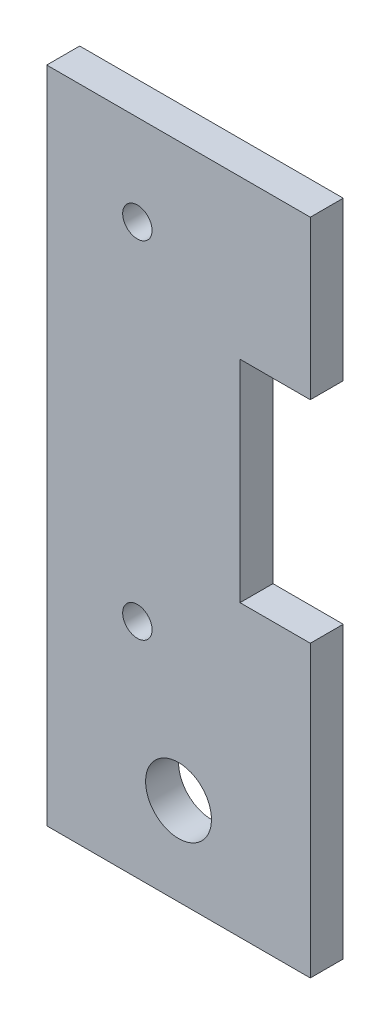
ISO-10303-21;
HEADER;
FILE_DESCRIPTION(('STEP AP214'),'2;1');
FILE_NAME('part.step','',(''),(''),'','','');
FILE_SCHEMA(('AUTOMOTIVE_DESIGN { 1 0 10303 214 1 1 1 1 }'));
ENDSEC;
DATA;
#1=APPLICATION_CONTEXT('core data for automotive mechanical design processes');
#2=APPLICATION_PROTOCOL_DEFINITION('international standard','automotive_design',2000,#1);
#3=PRODUCT_CONTEXT('',#1,'mechanical');
#4=PRODUCT('Part','Part','',(#3));
#5=PRODUCT_RELATED_PRODUCT_CATEGORY('part','',(#4));
#6=PRODUCT_DEFINITION_FORMATION('','',#4);
#7=PRODUCT_DEFINITION_CONTEXT('part definition',#1,'design');
#8=PRODUCT_DEFINITION('design','',#6,#7);
#9=PRODUCT_DEFINITION_SHAPE('','',#8);
#10=(LENGTH_UNIT() NAMED_UNIT(*) SI_UNIT(.MILLI.,.METRE.));
#11=(NAMED_UNIT(*) PLANE_ANGLE_UNIT() SI_UNIT($,.RADIAN.));
#12=(NAMED_UNIT(*) SI_UNIT($,.STERADIAN.) SOLID_ANGLE_UNIT());
#13=UNCERTAINTY_MEASURE_WITH_UNIT(LENGTH_MEASURE(1.E-05),#10,'distance_accuracy_value','');
#14=(GEOMETRIC_REPRESENTATION_CONTEXT(3) GLOBAL_UNCERTAINTY_ASSIGNED_CONTEXT((#13)) GLOBAL_UNIT_ASSIGNED_CONTEXT((#10,
#11,#12)) REPRESENTATION_CONTEXT('',''));
#15=CARTESIAN_POINT('',(0.,0.,0.));
#16=DIRECTION('',(0.,0.,1.));
#17=DIRECTION('',(1.,0.,0.));
#18=AXIS2_PLACEMENT_3D('',#15,#16,#17);
#19=CARTESIAN_POINT('',(0.,38.1,4.7625));
#20=DIRECTION('',(-1.,0.,0.));
#21=DIRECTION('',(0.,-1.,0.));
#22=AXIS2_PLACEMENT_3D('',#19,#20,#21);
#23=PLANE('',#22);
#24=DIRECTION('',(0.,0.,-1.));
#25=VECTOR('',#24,1.);
#26=CARTESIAN_POINT('',(0.,15.24,4.7625));
#27=LINE('',#26,#25);
#28=CARTESIAN_POINT('',(0.,15.24,4.7625));
#29=VERTEX_POINT('',#28);
#30=CARTESIAN_POINT('',(0.,15.24,0.));
#31=VERTEX_POINT('',#30);
#32=EDGE_CURVE('E165',#29,#31,#27,.T.);
#33=ORIENTED_EDGE('',*,*,#32,.T.);
#34=DIRECTION('',(0.,1.,0.));
#35=VECTOR('',#34,1.);
#36=CARTESIAN_POINT('',(0.,38.1,0.));
#37=LINE('',#36,#35);
#38=CARTESIAN_POINT('',(0.,38.1,0.));
#39=VERTEX_POINT('',#38);
#40=EDGE_CURVE('E187',#31,#39,#37,.T.);
#41=ORIENTED_EDGE('',*,*,#40,.T.);
#42=DIRECTION('',(0.,0.,-1.));
#43=VECTOR('',#42,1.);
#44=CARTESIAN_POINT('',(0.,38.1,4.7625));
#45=LINE('',#44,#43);
#46=CARTESIAN_POINT('',(0.,38.1,4.7625));
#47=VERTEX_POINT('',#46);
#48=EDGE_CURVE('E11',#47,#39,#45,.T.);
#49=ORIENTED_EDGE('',*,*,#48,.F.);
#50=DIRECTION('',(0.,1.,0.));
#51=VECTOR('',#50,1.);
#52=CARTESIAN_POINT('',(0.,38.1,4.7625));
#53=LINE('',#52,#51);
#54=EDGE_CURVE('E97',#29,#47,#53,.T.);
#55=ORIENTED_EDGE('',*,*,#54,.F.);
#56=EDGE_LOOP('',(#33,#41,#49,#55));
#57=FACE_BOUND('',#56,.T.);
#58=ADVANCED_FACE('F45',(#57),#23,.F.);
#59=DIRECTION('',(0.,0.,-1.));
#60=VECTOR('',#59,1.);
#61=CARTESIAN_POINT('',(0.,-15.24,4.7625));
#62=LINE('',#61,#60);
#63=CARTESIAN_POINT('',(0.,-15.24,4.7625));
#64=VERTEX_POINT('',#63);
#65=CARTESIAN_POINT('',(0.,-15.24,0.));
#66=VERTEX_POINT('',#65);
#67=EDGE_CURVE('E60',#64,#66,#62,.T.);
#68=ORIENTED_EDGE('',*,*,#67,.F.);
#69=CARTESIAN_POINT('',(0.,-57.15,4.7625));
#70=VERTEX_POINT('',#69);
#71=EDGE_CURVE('E171',#70,#64,#53,.T.);
#72=ORIENTED_EDGE('',*,*,#71,.F.);
#73=DIRECTION('',(0.,0.,-1.));
#74=VECTOR('',#73,1.);
#75=CARTESIAN_POINT('',(0.,-57.15,4.7625));
#76=LINE('',#75,#74);
#77=CARTESIAN_POINT('',(0.,-57.15,0.));
#78=VERTEX_POINT('',#77);
#79=EDGE_CURVE('E182',#70,#78,#76,.T.);
#80=ORIENTED_EDGE('',*,*,#79,.T.);
#81=EDGE_CURVE('E183',#78,#66,#37,.T.);
#82=ORIENTED_EDGE('',*,*,#81,.T.);
#83=EDGE_LOOP('',(#68,#72,#80,#82));
#84=FACE_BOUND('',#83,.T.);
#85=ADVANCED_FACE('F212',(#84),#23,.F.);
#86=CARTESIAN_POINT('',(0.,0.,4.7625));
#87=DIRECTION('',(0.,0.,-1.));
#88=DIRECTION('',(-1.,0.,0.));
#89=AXIS2_PLACEMENT_3D('',#86,#87,#88);
#90=PLANE('',#89);
#91=DIRECTION('',(-1.,0.,0.));
#92=VECTOR('',#91,1.);
#93=CARTESIAN_POINT('',(0.,15.24,4.7625));
#94=LINE('',#93,#92);
#95=CARTESIAN_POINT('',(-10.16,15.24,4.7625));
#96=VERTEX_POINT('',#95);
#97=EDGE_CURVE('E139',#29,#96,#94,.T.);
#98=ORIENTED_EDGE('',*,*,#97,.F.);
#99=ORIENTED_EDGE('',*,*,#54,.T.);
#100=DIRECTION('',(-1.,0.,0.));
#101=VECTOR('',#100,1.);
#102=CARTESIAN_POINT('',(0.,38.1,4.7625));
#103=LINE('',#102,#101);
#104=CARTESIAN_POINT('',(-38.1,38.1,4.7625));
#105=VERTEX_POINT('',#104);
#106=EDGE_CURVE('E174',#47,#105,#103,.T.);
#107=ORIENTED_EDGE('',*,*,#106,.T.);
#108=DIRECTION('',(0.,-1.,0.));
#109=VECTOR('',#108,1.);
#110=CARTESIAN_POINT('',(-38.1,38.1,4.7625));
#111=LINE('',#110,#109);
#112=CARTESIAN_POINT('',(-38.1,-57.15,4.7625));
#113=VERTEX_POINT('',#112);
#114=EDGE_CURVE('E177',#105,#113,#111,.T.);
#115=ORIENTED_EDGE('',*,*,#114,.T.);
#116=DIRECTION('',(1.,0.,0.));
#117=VECTOR('',#116,1.);
#118=CARTESIAN_POINT('',(0.,-57.15,4.7625));
#119=LINE('',#118,#117);
#120=EDGE_CURVE('E69',#113,#70,#119,.T.);
#121=ORIENTED_EDGE('',*,*,#120,.T.);
#122=ORIENTED_EDGE('',*,*,#71,.T.);
#123=DIRECTION('',(1.,0.,0.));
#124=VECTOR('',#123,1.);
#125=CARTESIAN_POINT('',(0.,-15.24,4.7625));
#126=LINE('',#125,#124);
#127=CARTESIAN_POINT('',(-10.16,-15.24,4.7625));
#128=VERTEX_POINT('',#127);
#129=EDGE_CURVE('E154',#128,#64,#126,.T.);
#130=ORIENTED_EDGE('',*,*,#129,.F.);
#131=DIRECTION('',(0.,-1.,0.));
#132=VECTOR('',#131,1.);
#133=CARTESIAN_POINT('',(-10.16,15.24,4.7625));
#134=LINE('',#133,#132);
#135=EDGE_CURVE('E128',#96,#128,#134,.T.);
#136=ORIENTED_EDGE('',*,*,#135,.F.);
#137=EDGE_LOOP('',(#98,#99,#107,#115,#121,#122,#130,#136));
#138=FACE_BOUND('',#137,.T.);
#139=CARTESIAN_POINT('',(-25.,25.,4.7625));
#140=DIRECTION('',(0.,0.,1.));
#141=DIRECTION('',(1.,0.,0.));
#142=AXIS2_PLACEMENT_3D('',#139,#140,#141);
#143=CIRCLE('',#142,2.125);
#144=CARTESIAN_POINT('',(-27.125,25.,4.7625));
#145=VERTEX_POINT('',#144);
#146=EDGE_CURVE('E166',#145,#145,#143,.T.);
#147=ORIENTED_EDGE('',*,*,#146,.F.);
#148=EDGE_LOOP('',(#147));
#149=FACE_BOUND('',#148,.T.);
#150=CARTESIAN_POINT('',(-25.,-25.,4.7625));
#151=DIRECTION('',(0.,0.,1.));
#152=DIRECTION('',(1.,0.,0.));
#153=AXIS2_PLACEMENT_3D('',#150,#151,#152);
#154=CIRCLE('',#153,2.125);
#155=CARTESIAN_POINT('',(-27.125,-25.,4.7625));
#156=VERTEX_POINT('',#155);
#157=EDGE_CURVE('E255',#156,#156,#154,.T.);
#158=ORIENTED_EDGE('',*,*,#157,.F.);
#159=EDGE_LOOP('',(#158));
#160=FACE_BOUND('',#159,.T.);
#161=CARTESIAN_POINT('',(-19.05,-44.45,4.7625));
#162=DIRECTION('',(0.,0.,1.));
#163=DIRECTION('',(1.,0.,0.));
#164=AXIS2_PLACEMENT_3D('',#161,#162,#163);
#165=CIRCLE('',#164,4.7625);
#166=CARTESIAN_POINT('',(-23.8125,-44.45,4.7625));
#167=VERTEX_POINT('',#166);
#168=EDGE_CURVE('E238',#167,#167,#165,.T.);
#169=ORIENTED_EDGE('',*,*,#168,.F.);
#170=EDGE_LOOP('',(#169));
#171=FACE_BOUND('',#170,.T.);
#172=ADVANCED_FACE('F232',(#138,#149,#160,#171),#90,.F.);
#173=CARTESIAN_POINT('',(0.,0.,0.));
#174=DIRECTION('',(0.,0.,-1.));
#175=DIRECTION('',(-1.,0.,0.));
#176=AXIS2_PLACEMENT_3D('',#173,#174,#175);
#177=PLANE('',#176);
#178=CARTESIAN_POINT('',(-25.,-25.,0.));
#179=DIRECTION('',(0.,0.,1.));
#180=DIRECTION('',(1.,0.,0.));
#181=AXIS2_PLACEMENT_3D('',#178,#179,#180);
#182=CIRCLE('',#181,2.125);
#183=CARTESIAN_POINT('',(-27.125,-25.,0.));
#184=VERTEX_POINT('',#183);
#185=EDGE_CURVE('E170',#184,#184,#182,.T.);
#186=ORIENTED_EDGE('',*,*,#185,.T.);
#187=EDGE_LOOP('',(#186));
#188=FACE_BOUND('',#187,.T.);
#189=ORIENTED_EDGE('',*,*,#40,.F.);
#190=DIRECTION('',(-1.,0.,0.));
#191=VECTOR('',#190,1.);
#192=CARTESIAN_POINT('',(0.,15.24,0.));
#193=LINE('',#192,#191);
#194=CARTESIAN_POINT('',(-10.16,15.24,0.));
#195=VERTEX_POINT('',#194);
#196=EDGE_CURVE('E144',#31,#195,#193,.T.);
#197=ORIENTED_EDGE('',*,*,#196,.T.);
#198=DIRECTION('',(0.,-1.,0.));
#199=VECTOR('',#198,1.);
#200=CARTESIAN_POINT('',(-10.16,15.24,0.));
#201=LINE('',#200,#199);
#202=CARTESIAN_POINT('',(-10.16,-15.24,0.));
#203=VERTEX_POINT('',#202);
#204=EDGE_CURVE('E125',#195,#203,#201,.T.);
#205=ORIENTED_EDGE('',*,*,#204,.T.);
#206=DIRECTION('',(1.,0.,0.));
#207=VECTOR('',#206,1.);
#208=CARTESIAN_POINT('',(0.,-15.24,0.));
#209=LINE('',#208,#207);
#210=EDGE_CURVE('E133',#203,#66,#209,.T.);
#211=ORIENTED_EDGE('',*,*,#210,.T.);
#212=ORIENTED_EDGE('',*,*,#81,.F.);
#213=DIRECTION('',(1.,0.,0.));
#214=VECTOR('',#213,1.);
#215=CARTESIAN_POINT('',(0.,-57.15,0.));
#216=LINE('',#215,#214);
#217=CARTESIAN_POINT('',(-38.1,-57.15,0.));
#218=VERTEX_POINT('',#217);
#219=EDGE_CURVE('E90',#218,#78,#216,.T.);
#220=ORIENTED_EDGE('',*,*,#219,.F.);
#221=DIRECTION('',(0.,-1.,0.));
#222=VECTOR('',#221,1.);
#223=CARTESIAN_POINT('',(-38.1,38.1,0.));
#224=LINE('',#223,#222);
#225=CARTESIAN_POINT('',(-38.1,38.1,0.));
#226=VERTEX_POINT('',#225);
#227=EDGE_CURVE('E190',#226,#218,#224,.T.);
#228=ORIENTED_EDGE('',*,*,#227,.F.);
#229=DIRECTION('',(-1.,0.,0.));
#230=VECTOR('',#229,1.);
#231=CARTESIAN_POINT('',(0.,38.1,0.));
#232=LINE('',#231,#230);
#233=EDGE_CURVE('E186',#39,#226,#232,.T.);
#234=ORIENTED_EDGE('',*,*,#233,.F.);
#235=EDGE_LOOP('',(#189,#197,#205,#211,#212,#220,#228,#234));
#236=FACE_BOUND('',#235,.T.);
#237=CARTESIAN_POINT('',(-25.,25.,0.));
#238=DIRECTION('',(0.,0.,1.));
#239=DIRECTION('',(1.,0.,0.));
#240=AXIS2_PLACEMENT_3D('',#237,#238,#239);
#241=CIRCLE('',#240,2.125);
#242=CARTESIAN_POINT('',(-27.125,25.,0.));
#243=VERTEX_POINT('',#242);
#244=EDGE_CURVE('E161',#243,#243,#241,.T.);
#245=ORIENTED_EDGE('',*,*,#244,.T.);
#246=EDGE_LOOP('',(#245));
#247=FACE_BOUND('',#246,.T.);
#248=CARTESIAN_POINT('',(-19.05,-44.45,0.));
#249=DIRECTION('',(0.,0.,1.));
#250=DIRECTION('',(1.,0.,0.));
#251=AXIS2_PLACEMENT_3D('',#248,#249,#250);
#252=CIRCLE('',#251,4.7625);
#253=CARTESIAN_POINT('',(-23.8125,-44.45,0.));
#254=VERTEX_POINT('',#253);
#255=EDGE_CURVE('E150',#254,#254,#252,.T.);
#256=ORIENTED_EDGE('',*,*,#255,.T.);
#257=EDGE_LOOP('',(#256));
#258=FACE_BOUND('',#257,.T.);
#259=ADVANCED_FACE('F142',(#188,#236,#247,#258),#177,.T.);
#260=CARTESIAN_POINT('',(0.,38.1,4.7625));
#261=DIRECTION('',(0.,-1.,0.));
#262=DIRECTION('',(1.,0.,0.));
#263=AXIS2_PLACEMENT_3D('',#260,#261,#262);
#264=PLANE('',#263);
#265=ORIENTED_EDGE('',*,*,#233,.T.);
#266=DIRECTION('',(0.,0.,-1.));
#267=VECTOR('',#266,1.);
#268=CARTESIAN_POINT('',(-38.1,38.1,4.7625));
#269=LINE('',#268,#267);
#270=EDGE_CURVE('E53',#105,#226,#269,.T.);
#271=ORIENTED_EDGE('',*,*,#270,.F.);
#272=ORIENTED_EDGE('',*,*,#106,.F.);
#273=ORIENTED_EDGE('',*,*,#48,.T.);
#274=EDGE_LOOP('',(#265,#271,#272,#273));
#275=FACE_BOUND('',#274,.T.);
#276=ADVANCED_FACE('F224',(#275),#264,.F.);
#277=CARTESIAN_POINT('',(-38.1,38.1,4.7625));
#278=DIRECTION('',(1.,0.,0.));
#279=DIRECTION('',(0.,1.,0.));
#280=AXIS2_PLACEMENT_3D('',#277,#278,#279);
#281=PLANE('',#280);
#282=ORIENTED_EDGE('',*,*,#227,.T.);
#283=DIRECTION('',(0.,0.,-1.));
#284=VECTOR('',#283,1.);
#285=CARTESIAN_POINT('',(-38.1,-57.15,4.7625));
#286=LINE('',#285,#284);
#287=EDGE_CURVE('E197',#113,#218,#286,.T.);
#288=ORIENTED_EDGE('',*,*,#287,.F.);
#289=ORIENTED_EDGE('',*,*,#114,.F.);
#290=ORIENTED_EDGE('',*,*,#270,.T.);
#291=EDGE_LOOP('',(#282,#288,#289,#290));
#292=FACE_BOUND('',#291,.T.);
#293=ADVANCED_FACE('F207',(#292),#281,.F.);
#294=CARTESIAN_POINT('',(0.,-57.15,4.7625));
#295=DIRECTION('',(0.,1.,0.));
#296=DIRECTION('',(-1.,0.,0.));
#297=AXIS2_PLACEMENT_3D('',#294,#295,#296);
#298=PLANE('',#297);
#299=ORIENTED_EDGE('',*,*,#219,.T.);
#300=ORIENTED_EDGE('',*,*,#79,.F.);
#301=ORIENTED_EDGE('',*,*,#120,.F.);
#302=ORIENTED_EDGE('',*,*,#287,.T.);
#303=EDGE_LOOP('',(#299,#300,#301,#302));
#304=FACE_BOUND('',#303,.T.);
#305=ADVANCED_FACE('F214',(#304),#298,.F.);
#306=CARTESIAN_POINT('',(0.,15.24,4.7625));
#307=DIRECTION('',(0.,-1.,0.));
#308=DIRECTION('',(0.,0.,-1.));
#309=AXIS2_PLACEMENT_3D('',#306,#307,#308);
#310=PLANE('',#309);
#311=ORIENTED_EDGE('',*,*,#196,.F.);
#312=ORIENTED_EDGE('',*,*,#32,.F.);
#313=ORIENTED_EDGE('',*,*,#97,.T.);
#314=DIRECTION('',(0.,0.,-1.));
#315=VECTOR('',#314,1.);
#316=CARTESIAN_POINT('',(-10.16,15.24,4.7625));
#317=LINE('',#316,#315);
#318=EDGE_CURVE('E131',#96,#195,#317,.T.);
#319=ORIENTED_EDGE('',*,*,#318,.T.);
#320=EDGE_LOOP('',(#311,#312,#313,#319));
#321=FACE_BOUND('',#320,.T.);
#322=ADVANCED_FACE('F216',(#321),#310,.T.);
#323=CARTESIAN_POINT('',(-10.16,15.24,4.7625));
#324=DIRECTION('',(1.,0.,0.));
#325=DIRECTION('',(0.,0.,-1.));
#326=AXIS2_PLACEMENT_3D('',#323,#324,#325);
#327=PLANE('',#326);
#328=ORIENTED_EDGE('',*,*,#204,.F.);
#329=ORIENTED_EDGE('',*,*,#318,.F.);
#330=ORIENTED_EDGE('',*,*,#135,.T.);
#331=DIRECTION('',(0.,0.,-1.));
#332=VECTOR('',#331,1.);
#333=CARTESIAN_POINT('',(-10.16,-15.24,4.7625));
#334=LINE('',#333,#332);
#335=EDGE_CURVE('E121',#128,#203,#334,.T.);
#336=ORIENTED_EDGE('',*,*,#335,.T.);
#337=EDGE_LOOP('',(#328,#329,#330,#336));
#338=FACE_BOUND('',#337,.T.);
#339=ADVANCED_FACE('F122',(#338),#327,.T.);
#340=CARTESIAN_POINT('',(0.,-15.24,4.7625));
#341=DIRECTION('',(0.,1.,0.));
#342=DIRECTION('',(0.,0.,1.));
#343=AXIS2_PLACEMENT_3D('',#340,#341,#342);
#344=PLANE('',#343);
#345=ORIENTED_EDGE('',*,*,#210,.F.);
#346=ORIENTED_EDGE('',*,*,#335,.F.);
#347=ORIENTED_EDGE('',*,*,#129,.T.);
#348=ORIENTED_EDGE('',*,*,#67,.T.);
#349=EDGE_LOOP('',(#345,#346,#347,#348));
#350=FACE_BOUND('',#349,.T.);
#351=ADVANCED_FACE('F134',(#350),#344,.T.);
#352=CARTESIAN_POINT('',(-25.,25.,4.7625));
#353=DIRECTION('',(0.,0.,-1.));
#354=DIRECTION('',(-1.,0.,0.));
#355=AXIS2_PLACEMENT_3D('',#352,#353,#354);
#356=CYLINDRICAL_SURFACE('',#355,2.125);
#357=CARTESIAN_POINT('',(-27.125,25.,4.7625));
#358=CARTESIAN_POINT('',(-27.125,25.,4.712890625));
#359=CARTESIAN_POINT('',(-27.125,25.,4.66328125));
#360=CARTESIAN_POINT('',(-27.125,25.,4.5640625));
#361=CARTESIAN_POINT('',(-27.125,25.,4.514453125));
#362=CARTESIAN_POINT('',(-27.125,25.,4.415234375));
#363=CARTESIAN_POINT('',(-27.125,25.,4.365625));
#364=CARTESIAN_POINT('',(-27.125,25.,4.26640625));
#365=CARTESIAN_POINT('',(-27.125,25.,4.216796875));
#366=CARTESIAN_POINT('',(-27.125,25.,4.117578125));
#367=CARTESIAN_POINT('',(-27.125,25.,4.06796875));
#368=CARTESIAN_POINT('',(-27.125,25.,3.96875));
#369=CARTESIAN_POINT('',(-27.125,25.,3.919140625));
#370=CARTESIAN_POINT('',(-27.125,25.,3.819921875));
#371=CARTESIAN_POINT('',(-27.125,25.,3.7703125));
#372=CARTESIAN_POINT('',(-27.125,25.,3.67109375));
#373=CARTESIAN_POINT('',(-27.125,25.,3.621484375));
#374=CARTESIAN_POINT('',(-27.125,25.,3.522265625));
#375=CARTESIAN_POINT('',(-27.125,25.,3.47265625));
#376=CARTESIAN_POINT('',(-27.125,25.,3.3734375));
#377=CARTESIAN_POINT('',(-27.125,25.,3.323828125));
#378=CARTESIAN_POINT('',(-27.125,25.,3.224609375));
#379=CARTESIAN_POINT('',(-27.125,25.,3.175));
#380=CARTESIAN_POINT('',(-27.125,25.,3.07578125));
#381=CARTESIAN_POINT('',(-27.125,25.,3.026171875));
#382=CARTESIAN_POINT('',(-27.125,25.,2.926953125));
#383=CARTESIAN_POINT('',(-27.125,25.,2.87734375));
#384=CARTESIAN_POINT('',(-27.125,25.,2.778125));
#385=CARTESIAN_POINT('',(-27.125,25.,2.728515625));
#386=CARTESIAN_POINT('',(-27.125,25.,2.629296875));
#387=CARTESIAN_POINT('',(-27.125,25.,2.5796875));
#388=CARTESIAN_POINT('',(-27.125,25.,2.48046875));
#389=CARTESIAN_POINT('',(-27.125,25.,2.430859375));
#390=CARTESIAN_POINT('',(-27.125,25.,2.331640625));
#391=CARTESIAN_POINT('',(-27.125,25.,2.28203125));
#392=CARTESIAN_POINT('',(-27.125,25.,2.1828125));
#393=CARTESIAN_POINT('',(-27.125,25.,2.133203125));
#394=CARTESIAN_POINT('',(-27.125,25.,2.033984375));
#395=CARTESIAN_POINT('',(-27.125,25.,1.984375));
#396=CARTESIAN_POINT('',(-27.125,25.,1.88515625));
#397=CARTESIAN_POINT('',(-27.125,25.,1.835546875));
#398=CARTESIAN_POINT('',(-27.125,25.,1.736328125));
#399=CARTESIAN_POINT('',(-27.125,25.,1.68671875));
#400=CARTESIAN_POINT('',(-27.125,25.,1.5875));
#401=CARTESIAN_POINT('',(-27.125,25.,1.537890625));
#402=CARTESIAN_POINT('',(-27.125,25.,1.438671875));
#403=CARTESIAN_POINT('',(-27.125,25.,1.3890625));
#404=CARTESIAN_POINT('',(-27.125,25.,1.28984375));
#405=CARTESIAN_POINT('',(-27.125,25.,1.240234375));
#406=CARTESIAN_POINT('',(-27.125,25.,1.141015625));
#407=CARTESIAN_POINT('',(-27.125,25.,1.09140625));
#408=CARTESIAN_POINT('',(-27.125,25.,0.9921875));
#409=CARTESIAN_POINT('',(-27.125,25.,0.942578125));
#410=CARTESIAN_POINT('',(-27.125,25.,0.843359375));
#411=CARTESIAN_POINT('',(-27.125,25.,0.79375));
#412=CARTESIAN_POINT('',(-27.125,25.,0.69453125));
#413=CARTESIAN_POINT('',(-27.125,25.,0.644921875));
#414=CARTESIAN_POINT('',(-27.125,25.,0.545703125));
#415=CARTESIAN_POINT('',(-27.125,25.,0.49609375));
#416=CARTESIAN_POINT('',(-27.125,25.,0.396875));
#417=CARTESIAN_POINT('',(-27.125,25.,0.347265625));
#418=CARTESIAN_POINT('',(-27.125,25.,0.248046875));
#419=CARTESIAN_POINT('',(-27.125,25.,0.1984375));
#420=CARTESIAN_POINT('',(-27.125,25.,0.09921875));
#421=CARTESIAN_POINT('',(-27.125,25.,0.049609375));
#422=CARTESIAN_POINT('',(-27.125,25.,0.));
#423=B_SPLINE_CURVE_WITH_KNOTS('',3,(#357,#358,#359,#360,#361,#362,#363,#364,#365,#366,#367,
#368,#369,#370,#371,#372,#373,#374,#375,#376,#377,#378,#379,#380,#381,#382,#383,#384,#385,#386,
#387,#388,#389,#390,#391,#392,#393,#394,#395,#396,#397,#398,#399,#400,#401,#402,#403,#404,#405,
#406,#407,#408,#409,#410,#411,#412,#413,#414,#415,#416,#417,#418,#419,#420,#421,#422),
.UNSPECIFIED.,.F.,.F.,(4,2,2,2,2,2,2,2,2,2,2,2,2,2,2,2,2,2,2,2,2,2,2,2,2,2,2,2,2,2,2,2,4),(0.,
0.148828124999999,0.297656249999999,0.446484374999999,0.595312499999999,0.744140625,0.89296875,
1.041796875,1.190625,1.339453125,1.48828125,1.637109375,1.7859375,1.934765625,2.08359375,
2.232421875,2.38125,2.530078125,2.67890625,2.827734375,2.9765625,3.125390625,3.27421875,
3.423046875,3.571875,3.720703125,3.86953125,4.018359375,4.1671875,4.316015625,4.46484375,
4.613671875,4.7625),.UNSPECIFIED.);
#424=EDGE_CURVE('BSEAM326',#145,#243,#423,.T.);
#425=ORIENTED_EDGE('',*,*,#146,.T.);
#426=ORIENTED_EDGE('',*,*,#244,.F.);
#427=ORIENTED_EDGE('',*,*,#424,.T.);
#428=ORIENTED_EDGE('',*,*,#424,.F.);
#429=EDGE_LOOP('',(#425,#427,#426,#428));
#430=FACE_BOUND('',#429,.T.);
#431=ADVANCED_FACE('F326',(#430),#356,.F.);
#432=CARTESIAN_POINT('',(-25.,-25.,4.7625));
#433=DIRECTION('',(0.,0.,-1.));
#434=DIRECTION('',(-1.,0.,0.));
#435=AXIS2_PLACEMENT_3D('',#432,#433,#434);
#436=CYLINDRICAL_SURFACE('',#435,2.125);
#437=CARTESIAN_POINT('',(-27.125,-25.,4.7625));
#438=CARTESIAN_POINT('',(-27.125,-25.,4.712890625));
#439=CARTESIAN_POINT('',(-27.125,-25.,4.66328125));
#440=CARTESIAN_POINT('',(-27.125,-25.,4.5640625));
#441=CARTESIAN_POINT('',(-27.125,-25.,4.514453125));
#442=CARTESIAN_POINT('',(-27.125,-25.,4.415234375));
#443=CARTESIAN_POINT('',(-27.125,-25.,4.365625));
#444=CARTESIAN_POINT('',(-27.125,-25.,4.26640625));
#445=CARTESIAN_POINT('',(-27.125,-25.,4.216796875));
#446=CARTESIAN_POINT('',(-27.125,-25.,4.117578125));
#447=CARTESIAN_POINT('',(-27.125,-25.,4.06796875));
#448=CARTESIAN_POINT('',(-27.125,-25.,3.96875));
#449=CARTESIAN_POINT('',(-27.125,-25.,3.919140625));
#450=CARTESIAN_POINT('',(-27.125,-25.,3.819921875));
#451=CARTESIAN_POINT('',(-27.125,-25.,3.7703125));
#452=CARTESIAN_POINT('',(-27.125,-25.,3.67109375));
#453=CARTESIAN_POINT('',(-27.125,-25.,3.621484375));
#454=CARTESIAN_POINT('',(-27.125,-25.,3.522265625));
#455=CARTESIAN_POINT('',(-27.125,-25.,3.47265625));
#456=CARTESIAN_POINT('',(-27.125,-25.,3.3734375));
#457=CARTESIAN_POINT('',(-27.125,-25.,3.323828125));
#458=CARTESIAN_POINT('',(-27.125,-25.,3.224609375));
#459=CARTESIAN_POINT('',(-27.125,-25.,3.175));
#460=CARTESIAN_POINT('',(-27.125,-25.,3.07578125));
#461=CARTESIAN_POINT('',(-27.125,-25.,3.026171875));
#462=CARTESIAN_POINT('',(-27.125,-25.,2.926953125));
#463=CARTESIAN_POINT('',(-27.125,-25.,2.87734375));
#464=CARTESIAN_POINT('',(-27.125,-25.,2.778125));
#465=CARTESIAN_POINT('',(-27.125,-25.,2.728515625));
#466=CARTESIAN_POINT('',(-27.125,-25.,2.629296875));
#467=CARTESIAN_POINT('',(-27.125,-25.,2.5796875));
#468=CARTESIAN_POINT('',(-27.125,-25.,2.48046875));
#469=CARTESIAN_POINT('',(-27.125,-25.,2.430859375));
#470=CARTESIAN_POINT('',(-27.125,-25.,2.331640625));
#471=CARTESIAN_POINT('',(-27.125,-25.,2.28203125));
#472=CARTESIAN_POINT('',(-27.125,-25.,2.1828125));
#473=CARTESIAN_POINT('',(-27.125,-25.,2.133203125));
#474=CARTESIAN_POINT('',(-27.125,-25.,2.033984375));
#475=CARTESIAN_POINT('',(-27.125,-25.,1.984375));
#476=CARTESIAN_POINT('',(-27.125,-25.,1.88515625));
#477=CARTESIAN_POINT('',(-27.125,-25.,1.835546875));
#478=CARTESIAN_POINT('',(-27.125,-25.,1.736328125));
#479=CARTESIAN_POINT('',(-27.125,-25.,1.68671875));
#480=CARTESIAN_POINT('',(-27.125,-25.,1.5875));
#481=CARTESIAN_POINT('',(-27.125,-25.,1.537890625));
#482=CARTESIAN_POINT('',(-27.125,-25.,1.438671875));
#483=CARTESIAN_POINT('',(-27.125,-25.,1.3890625));
#484=CARTESIAN_POINT('',(-27.125,-25.,1.28984375));
#485=CARTESIAN_POINT('',(-27.125,-25.,1.240234375));
#486=CARTESIAN_POINT('',(-27.125,-25.,1.141015625));
#487=CARTESIAN_POINT('',(-27.125,-25.,1.09140625));
#488=CARTESIAN_POINT('',(-27.125,-25.,0.9921875));
#489=CARTESIAN_POINT('',(-27.125,-25.,0.942578125));
#490=CARTESIAN_POINT('',(-27.125,-25.,0.843359375));
#491=CARTESIAN_POINT('',(-27.125,-25.,0.79375));
#492=CARTESIAN_POINT('',(-27.125,-25.,0.69453125));
#493=CARTESIAN_POINT('',(-27.125,-25.,0.644921875));
#494=CARTESIAN_POINT('',(-27.125,-25.,0.545703125));
#495=CARTESIAN_POINT('',(-27.125,-25.,0.49609375));
#496=CARTESIAN_POINT('',(-27.125,-25.,0.396875));
#497=CARTESIAN_POINT('',(-27.125,-25.,0.347265625));
#498=CARTESIAN_POINT('',(-27.125,-25.,0.248046875));
#499=CARTESIAN_POINT('',(-27.125,-25.,0.1984375));
#500=CARTESIAN_POINT('',(-27.125,-25.,0.09921875));
#501=CARTESIAN_POINT('',(-27.125,-25.,0.049609375));
#502=CARTESIAN_POINT('',(-27.125,-25.,0.));
#503=B_SPLINE_CURVE_WITH_KNOTS('',3,(#437,#438,#439,#440,#441,#442,#443,#444,#445,#446,#447,
#448,#449,#450,#451,#452,#453,#454,#455,#456,#457,#458,#459,#460,#461,#462,#463,#464,#465,#466,
#467,#468,#469,#470,#471,#472,#473,#474,#475,#476,#477,#478,#479,#480,#481,#482,#483,#484,#485,
#486,#487,#488,#489,#490,#491,#492,#493,#494,#495,#496,#497,#498,#499,#500,#501,#502),
.UNSPECIFIED.,.F.,.F.,(4,2,2,2,2,2,2,2,2,2,2,2,2,2,2,2,2,2,2,2,2,2,2,2,2,2,2,2,2,2,2,2,4),(0.,
0.148828124999999,0.297656249999999,0.446484374999999,0.595312499999999,0.744140625,0.89296875,
1.041796875,1.190625,1.339453125,1.48828125,1.637109375,1.7859375,1.934765625,2.08359375,
2.232421875,2.38125,2.530078125,2.67890625,2.827734375,2.9765625,3.125390625,3.27421875,
3.423046875,3.571875,3.720703125,3.86953125,4.018359375,4.1671875,4.316015625,4.46484375,
4.613671875,4.7625),.UNSPECIFIED.);
#504=EDGE_CURVE('BSEAM322',#156,#184,#503,.T.);
#505=ORIENTED_EDGE('',*,*,#157,.T.);
#506=ORIENTED_EDGE('',*,*,#185,.F.);
#507=ORIENTED_EDGE('',*,*,#504,.T.);
#508=ORIENTED_EDGE('',*,*,#504,.F.);
#509=EDGE_LOOP('',(#505,#507,#506,#508));
#510=FACE_BOUND('',#509,.T.);
#511=ADVANCED_FACE('F322',(#510),#436,.F.);
#512=CARTESIAN_POINT('',(-19.05,-44.45,4.7625));
#513=DIRECTION('',(0.,0.,-1.));
#514=DIRECTION('',(-1.,0.,0.));
#515=AXIS2_PLACEMENT_3D('',#512,#513,#514);
#516=CYLINDRICAL_SURFACE('',#515,4.7625);
#517=CARTESIAN_POINT('',(-23.8125,-44.45,4.7625));
#518=CARTESIAN_POINT('',(-23.8125,-44.45,4.712890625));
#519=CARTESIAN_POINT('',(-23.8125,-44.45,4.66328125));
#520=CARTESIAN_POINT('',(-23.8125,-44.45,4.5640625));
#521=CARTESIAN_POINT('',(-23.8125,-44.45,4.514453125));
#522=CARTESIAN_POINT('',(-23.8125,-44.45,4.415234375));
#523=CARTESIAN_POINT('',(-23.8125,-44.45,4.365625));
#524=CARTESIAN_POINT('',(-23.8125,-44.45,4.26640625));
#525=CARTESIAN_POINT('',(-23.8125,-44.45,4.216796875));
#526=CARTESIAN_POINT('',(-23.8125,-44.45,4.117578125));
#527=CARTESIAN_POINT('',(-23.8125,-44.45,4.06796875));
#528=CARTESIAN_POINT('',(-23.8125,-44.45,3.96875));
#529=CARTESIAN_POINT('',(-23.8125,-44.45,3.919140625));
#530=CARTESIAN_POINT('',(-23.8125,-44.45,3.819921875));
#531=CARTESIAN_POINT('',(-23.8125,-44.45,3.7703125));
#532=CARTESIAN_POINT('',(-23.8125,-44.45,3.67109375));
#533=CARTESIAN_POINT('',(-23.8125,-44.45,3.621484375));
#534=CARTESIAN_POINT('',(-23.8125,-44.45,3.522265625));
#535=CARTESIAN_POINT('',(-23.8125,-44.45,3.47265625));
#536=CARTESIAN_POINT('',(-23.8125,-44.45,3.3734375));
#537=CARTESIAN_POINT('',(-23.8125,-44.45,3.323828125));
#538=CARTESIAN_POINT('',(-23.8125,-44.45,3.224609375));
#539=CARTESIAN_POINT('',(-23.8125,-44.45,3.175));
#540=CARTESIAN_POINT('',(-23.8125,-44.45,3.07578125));
#541=CARTESIAN_POINT('',(-23.8125,-44.45,3.026171875));
#542=CARTESIAN_POINT('',(-23.8125,-44.45,2.926953125));
#543=CARTESIAN_POINT('',(-23.8125,-44.45,2.87734375));
#544=CARTESIAN_POINT('',(-23.8125,-44.45,2.778125));
#545=CARTESIAN_POINT('',(-23.8125,-44.45,2.728515625));
#546=CARTESIAN_POINT('',(-23.8125,-44.45,2.629296875));
#547=CARTESIAN_POINT('',(-23.8125,-44.45,2.5796875));
#548=CARTESIAN_POINT('',(-23.8125,-44.45,2.48046875));
#549=CARTESIAN_POINT('',(-23.8125,-44.45,2.430859375));
#550=CARTESIAN_POINT('',(-23.8125,-44.45,2.331640625));
#551=CARTESIAN_POINT('',(-23.8125,-44.45,2.28203125));
#552=CARTESIAN_POINT('',(-23.8125,-44.45,2.1828125));
#553=CARTESIAN_POINT('',(-23.8125,-44.45,2.133203125));
#554=CARTESIAN_POINT('',(-23.8125,-44.45,2.033984375));
#555=CARTESIAN_POINT('',(-23.8125,-44.45,1.984375));
#556=CARTESIAN_POINT('',(-23.8125,-44.45,1.88515625));
#557=CARTESIAN_POINT('',(-23.8125,-44.45,1.835546875));
#558=CARTESIAN_POINT('',(-23.8125,-44.45,1.736328125));
#559=CARTESIAN_POINT('',(-23.8125,-44.45,1.68671875));
#560=CARTESIAN_POINT('',(-23.8125,-44.45,1.5875));
#561=CARTESIAN_POINT('',(-23.8125,-44.45,1.537890625));
#562=CARTESIAN_POINT('',(-23.8125,-44.45,1.438671875));
#563=CARTESIAN_POINT('',(-23.8125,-44.45,1.3890625));
#564=CARTESIAN_POINT('',(-23.8125,-44.45,1.28984375));
#565=CARTESIAN_POINT('',(-23.8125,-44.45,1.240234375));
#566=CARTESIAN_POINT('',(-23.8125,-44.45,1.141015625));
#567=CARTESIAN_POINT('',(-23.8125,-44.45,1.09140625));
#568=CARTESIAN_POINT('',(-23.8125,-44.45,0.992187499999999));
#569=CARTESIAN_POINT('',(-23.8125,-44.45,0.942578124999999));
#570=CARTESIAN_POINT('',(-23.8125,-44.45,0.843359375));
#571=CARTESIAN_POINT('',(-23.8125,-44.45,0.79375));
#572=CARTESIAN_POINT('',(-23.8125,-44.45,0.69453125));
#573=CARTESIAN_POINT('',(-23.8125,-44.45,0.644921875));
#574=CARTESIAN_POINT('',(-23.8125,-44.45,0.545703125));
#575=CARTESIAN_POINT('',(-23.8125,-44.45,0.49609375));
#576=CARTESIAN_POINT('',(-23.8125,-44.45,0.396875));
#577=CARTESIAN_POINT('',(-23.8125,-44.45,0.347265625));
#578=CARTESIAN_POINT('',(-23.8125,-44.45,0.248046875));
#579=CARTESIAN_POINT('',(-23.8125,-44.45,0.1984375));
#580=CARTESIAN_POINT('',(-23.8125,-44.45,0.09921875));
#581=CARTESIAN_POINT('',(-23.8125,-44.45,0.049609375));
#582=CARTESIAN_POINT('',(-23.8125,-44.45,0.));
#583=B_SPLINE_CURVE_WITH_KNOTS('',3,(#517,#518,#519,#520,#521,#522,#523,#524,#525,#526,#527,
#528,#529,#530,#531,#532,#533,#534,#535,#536,#537,#538,#539,#540,#541,#542,#543,#544,#545,#546,
#547,#548,#549,#550,#551,#552,#553,#554,#555,#556,#557,#558,#559,#560,#561,#562,#563,#564,#565,
#566,#567,#568,#569,#570,#571,#572,#573,#574,#575,#576,#577,#578,#579,#580,#581,#582),
.UNSPECIFIED.,.F.,.F.,(4,2,2,2,2,2,2,2,2,2,2,2,2,2,2,2,2,2,2,2,2,2,2,2,2,2,2,2,2,2,2,2,4),(0.,
0.148828125,0.29765625,0.446484375,0.5953125,0.744140625,0.892968750000001,1.041796875,1.190625,
1.339453125,1.48828125,1.637109375,1.7859375,1.934765625,2.08359375,2.232421875,2.38125,
2.530078125,2.67890625,2.827734375,2.9765625,3.125390625,3.27421875,3.423046875,3.571875,
3.720703125,3.86953125,4.018359375,4.1671875,4.316015625,4.46484375,4.613671875,4.7625),.UNSPECIFIED.);
#584=EDGE_CURVE('BSEAM325',#167,#254,#583,.T.);
#585=ORIENTED_EDGE('',*,*,#168,.T.);
#586=ORIENTED_EDGE('',*,*,#255,.F.);
#587=ORIENTED_EDGE('',*,*,#584,.T.);
#588=ORIENTED_EDGE('',*,*,#584,.F.);
#589=EDGE_LOOP('',(#585,#587,#586,#588));
#590=FACE_BOUND('',#589,.T.);
#591=ADVANCED_FACE('F325',(#590),#516,.F.);
#592=CLOSED_SHELL('',(#58,#85,#172,#259,#276,#293,#305,#322,#339,#351,#431,#511,#591));
#593=MANIFOLD_SOLID_BREP('B2',#592);
#594=ADVANCED_BREP_SHAPE_REPRESENTATION('',(#18,#593),#14);
#595=SHAPE_DEFINITION_REPRESENTATION(#9,#594);
ENDSEC;
END-ISO-10303-21;
